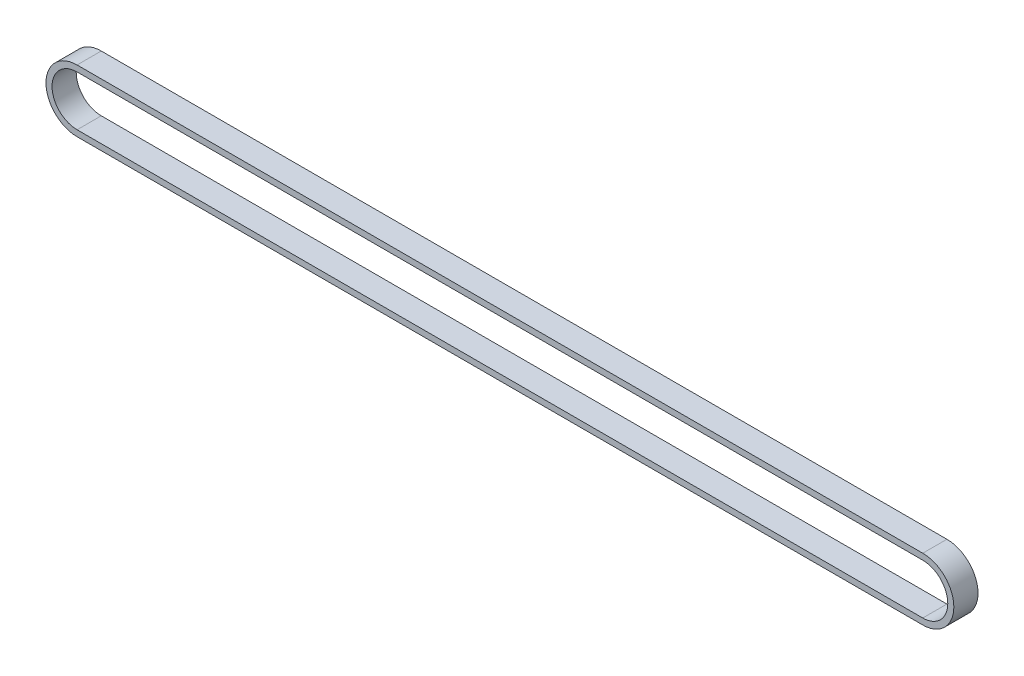
ISO-10303-21;
HEADER;
FILE_DESCRIPTION(('STEP AP214'),'2;1');
FILE_NAME('part.step','',(''),(''),'','','');
FILE_SCHEMA(('AUTOMOTIVE_DESIGN { 1 0 10303 214 1 1 1 1 }'));
ENDSEC;
DATA;
#1=APPLICATION_CONTEXT('core data for automotive mechanical design processes');
#2=APPLICATION_PROTOCOL_DEFINITION('international standard','automotive_design',2000,#1);
#3=PRODUCT_CONTEXT('',#1,'mechanical');
#4=PRODUCT('Part','Part','',(#3));
#5=PRODUCT_RELATED_PRODUCT_CATEGORY('part','',(#4));
#6=PRODUCT_DEFINITION_FORMATION('','',#4);
#7=PRODUCT_DEFINITION_CONTEXT('part definition',#1,'design');
#8=PRODUCT_DEFINITION('design','',#6,#7);
#9=PRODUCT_DEFINITION_SHAPE('','',#8);
#10=(LENGTH_UNIT() NAMED_UNIT(*) SI_UNIT(.MILLI.,.METRE.));
#11=(NAMED_UNIT(*) PLANE_ANGLE_UNIT() SI_UNIT($,.RADIAN.));
#12=(NAMED_UNIT(*) SI_UNIT($,.STERADIAN.) SOLID_ANGLE_UNIT());
#13=UNCERTAINTY_MEASURE_WITH_UNIT(LENGTH_MEASURE(1.E-05),#10,'distance_accuracy_value','');
#14=(GEOMETRIC_REPRESENTATION_CONTEXT(3) GLOBAL_UNCERTAINTY_ASSIGNED_CONTEXT((#13)) GLOBAL_UNIT_ASSIGNED_CONTEXT((#10,
#11,#12)) REPRESENTATION_CONTEXT('',''));
#15=CARTESIAN_POINT('',(0.,0.,0.));
#16=DIRECTION('',(0.,0.,1.));
#17=DIRECTION('',(1.,0.,0.));
#18=AXIS2_PLACEMENT_3D('',#15,#16,#17);
#19=CARTESIAN_POINT('',(0.,0.,6.));
#20=DIRECTION('',(0.,0.,1.));
#21=DIRECTION('',(1.,0.,0.));
#22=AXIS2_PLACEMENT_3D('',#19,#20,#21);
#23=PLANE('',#22);
#24=CARTESIAN_POINT('',(0.,0.,6.));
#25=DIRECTION('',(0.,0.,1.));
#26=DIRECTION('',(1.,0.,0.));
#27=AXIS2_PLACEMENT_3D('',#24,#25,#26);
#28=CIRCLE('',#27,7.72);
#29=CARTESIAN_POINT('',(0.,7.72,6.));
#30=VERTEX_POINT('',#29);
#31=CARTESIAN_POINT('',(0.,-7.72,6.));
#32=VERTEX_POINT('',#31);
#33=EDGE_CURVE('E135',#30,#32,#28,.T.);
#34=ORIENTED_EDGE('',*,*,#33,.T.);
#35=DIRECTION('',(1.,0.,0.));
#36=VECTOR('',#35,1.);
#37=CARTESIAN_POINT('',(0.,-7.72,6.));
#38=LINE('',#37,#36);
#39=CARTESIAN_POINT('',(210.,-7.72,6.));
#40=VERTEX_POINT('',#39);
#41=EDGE_CURVE('E138',#32,#40,#38,.T.);
#42=ORIENTED_EDGE('',*,*,#41,.T.);
#43=CARTESIAN_POINT('',(210.,0.,6.));
#44=DIRECTION('',(0.,0.,1.));
#45=DIRECTION('',(1.,0.,0.));
#46=AXIS2_PLACEMENT_3D('',#43,#44,#45);
#47=CIRCLE('',#46,7.72);
#48=CARTESIAN_POINT('',(210.,7.72,6.));
#49=VERTEX_POINT('',#48);
#50=EDGE_CURVE('E141',#40,#49,#47,.T.);
#51=ORIENTED_EDGE('',*,*,#50,.T.);
#52=DIRECTION('',(-1.,0.,0.));
#53=VECTOR('',#52,1.);
#54=CARTESIAN_POINT('',(0.,7.72,6.));
#55=LINE('',#54,#53);
#56=EDGE_CURVE('E143',#49,#30,#55,.T.);
#57=ORIENTED_EDGE('',*,*,#56,.T.);
#58=EDGE_LOOP('',(#34,#42,#51,#57));
#59=FACE_BOUND('',#58,.T.);
#60=DIRECTION('',(1.,0.,0.));
#61=VECTOR('',#60,1.);
#62=CARTESIAN_POINT('',(0.,-6.215,6.));
#63=LINE('',#62,#61);
#64=CARTESIAN_POINT('',(0.,-6.215,6.));
#65=VERTEX_POINT('',#64);
#66=CARTESIAN_POINT('',(210.,-6.215,6.));
#67=VERTEX_POINT('',#66);
#68=EDGE_CURVE('E107',#65,#67,#63,.T.);
#69=ORIENTED_EDGE('',*,*,#68,.F.);
#70=CARTESIAN_POINT('',(0.,0.,6.));
#71=DIRECTION('',(0.,0.,1.));
#72=DIRECTION('',(1.,0.,0.));
#73=AXIS2_PLACEMENT_3D('',#70,#71,#72);
#74=CIRCLE('',#73,6.215);
#75=CARTESIAN_POINT('',(0.,6.215,6.));
#76=VERTEX_POINT('',#75);
#77=EDGE_CURVE('E99',#76,#65,#74,.T.);
#78=ORIENTED_EDGE('',*,*,#77,.F.);
#79=DIRECTION('',(-1.,0.,0.));
#80=VECTOR('',#79,1.);
#81=CARTESIAN_POINT('',(0.,6.215,6.));
#82=LINE('',#81,#80);
#83=CARTESIAN_POINT('',(210.,6.215,6.));
#84=VERTEX_POINT('',#83);
#85=EDGE_CURVE('E121',#84,#76,#82,.T.);
#86=ORIENTED_EDGE('',*,*,#85,.F.);
#87=CARTESIAN_POINT('',(210.,0.,6.));
#88=DIRECTION('',(0.,0.,1.));
#89=DIRECTION('',(1.,0.,0.));
#90=AXIS2_PLACEMENT_3D('',#87,#88,#89);
#91=CIRCLE('',#90,6.215);
#92=EDGE_CURVE('E119',#67,#84,#91,.T.);
#93=ORIENTED_EDGE('',*,*,#92,.F.);
#94=EDGE_LOOP('',(#69,#78,#86,#93));
#95=FACE_BOUND('',#94,.T.);
#96=ADVANCED_FACE('F34',(#59,#95),#23,.T.);
#97=CARTESIAN_POINT('',(0.,0.,0.));
#98=DIRECTION('',(0.,0.,1.));
#99=DIRECTION('',(1.,0.,0.));
#100=AXIS2_PLACEMENT_3D('',#97,#98,#99);
#101=PLANE('',#100);
#102=CARTESIAN_POINT('',(0.,0.,0.));
#103=DIRECTION('',(0.,0.,1.));
#104=DIRECTION('',(1.,0.,0.));
#105=AXIS2_PLACEMENT_3D('',#102,#103,#104);
#106=CIRCLE('',#105,7.72);
#107=CARTESIAN_POINT('',(0.,7.72,0.));
#108=VERTEX_POINT('',#107);
#109=CARTESIAN_POINT('',(0.,-7.72,0.));
#110=VERTEX_POINT('',#109);
#111=EDGE_CURVE('E115',#108,#110,#106,.T.);
#112=ORIENTED_EDGE('',*,*,#111,.F.);
#113=DIRECTION('',(-1.,0.,0.));
#114=VECTOR('',#113,1.);
#115=CARTESIAN_POINT('',(0.,7.72,0.));
#116=LINE('',#115,#114);
#117=CARTESIAN_POINT('',(210.,7.72,0.));
#118=VERTEX_POINT('',#117);
#119=EDGE_CURVE('E139',#118,#108,#116,.T.);
#120=ORIENTED_EDGE('',*,*,#119,.F.);
#121=CARTESIAN_POINT('',(210.,0.,0.));
#122=DIRECTION('',(0.,0.,1.));
#123=DIRECTION('',(1.,0.,0.));
#124=AXIS2_PLACEMENT_3D('',#121,#122,#123);
#125=CIRCLE('',#124,7.72);
#126=CARTESIAN_POINT('',(210.,-7.72,0.));
#127=VERTEX_POINT('',#126);
#128=EDGE_CURVE('E150',#127,#118,#125,.T.);
#129=ORIENTED_EDGE('',*,*,#128,.F.);
#130=DIRECTION('',(1.,0.,0.));
#131=VECTOR('',#130,1.);
#132=CARTESIAN_POINT('',(0.,-7.72,0.));
#133=LINE('',#132,#131);
#134=EDGE_CURVE('E148',#110,#127,#133,.T.);
#135=ORIENTED_EDGE('',*,*,#134,.F.);
#136=EDGE_LOOP('',(#112,#120,#129,#135));
#137=FACE_BOUND('',#136,.T.);
#138=CARTESIAN_POINT('',(0.,0.,0.));
#139=DIRECTION('',(0.,0.,1.));
#140=DIRECTION('',(1.,0.,0.));
#141=AXIS2_PLACEMENT_3D('',#138,#139,#140);
#142=CIRCLE('',#141,6.215);
#143=CARTESIAN_POINT('',(0.,6.215,0.));
#144=VERTEX_POINT('',#143);
#145=CARTESIAN_POINT('',(0.,-6.215,0.));
#146=VERTEX_POINT('',#145);
#147=EDGE_CURVE('E57',#144,#146,#142,.T.);
#148=ORIENTED_EDGE('',*,*,#147,.T.);
#149=DIRECTION('',(1.,0.,0.));
#150=VECTOR('',#149,1.);
#151=CARTESIAN_POINT('',(0.,-6.215,0.));
#152=LINE('',#151,#150);
#153=CARTESIAN_POINT('',(210.,-6.215,0.));
#154=VERTEX_POINT('',#153);
#155=EDGE_CURVE('E114',#146,#154,#152,.T.);
#156=ORIENTED_EDGE('',*,*,#155,.T.);
#157=CARTESIAN_POINT('',(210.,0.,0.));
#158=DIRECTION('',(0.,0.,1.));
#159=DIRECTION('',(1.,0.,0.));
#160=AXIS2_PLACEMENT_3D('',#157,#158,#159);
#161=CIRCLE('',#160,6.215);
#162=CARTESIAN_POINT('',(210.,6.215,0.));
#163=VERTEX_POINT('',#162);
#164=EDGE_CURVE('E127',#154,#163,#161,.T.);
#165=ORIENTED_EDGE('',*,*,#164,.T.);
#166=DIRECTION('',(-1.,0.,0.));
#167=VECTOR('',#166,1.);
#168=CARTESIAN_POINT('',(0.,6.215,0.));
#169=LINE('',#168,#167);
#170=EDGE_CURVE('E108',#163,#144,#169,.T.);
#171=ORIENTED_EDGE('',*,*,#170,.T.);
#172=EDGE_LOOP('',(#148,#156,#165,#171));
#173=FACE_BOUND('',#172,.T.);
#174=ADVANCED_FACE('F168',(#137,#173),#101,.F.);
#175=CARTESIAN_POINT('',(0.,0.,6.));
#176=DIRECTION('',(0.,0.,-1.));
#177=DIRECTION('',(-1.,0.,0.));
#178=AXIS2_PLACEMENT_3D('',#175,#176,#177);
#179=CYLINDRICAL_SURFACE('',#178,7.72);
#180=ORIENTED_EDGE('',*,*,#111,.T.);
#181=DIRECTION('',(0.,0.,-1.));
#182=VECTOR('',#181,1.);
#183=CARTESIAN_POINT('',(0.,-7.72,6.));
#184=LINE('',#183,#182);
#185=EDGE_CURVE('E11',#32,#110,#184,.T.);
#186=ORIENTED_EDGE('',*,*,#185,.F.);
#187=ORIENTED_EDGE('',*,*,#33,.F.);
#188=DIRECTION('',(0.,0.,-1.));
#189=VECTOR('',#188,1.);
#190=CARTESIAN_POINT('',(0.,7.72,6.));
#191=LINE('',#190,#189);
#192=EDGE_CURVE('E145',#30,#108,#191,.T.);
#193=ORIENTED_EDGE('',*,*,#192,.T.);
#194=EDGE_LOOP('',(#180,#186,#187,#193));
#195=FACE_BOUND('',#194,.T.);
#196=ADVANCED_FACE('F36',(#195),#179,.T.);
#197=CARTESIAN_POINT('',(0.,-7.72,6.));
#198=DIRECTION('',(0.,1.,0.));
#199=DIRECTION('',(0.,0.,1.));
#200=AXIS2_PLACEMENT_3D('',#197,#198,#199);
#201=PLANE('',#200);
#202=ORIENTED_EDGE('',*,*,#134,.T.);
#203=DIRECTION('',(0.,0.,-1.));
#204=VECTOR('',#203,1.);
#205=CARTESIAN_POINT('',(210.,-7.72,6.));
#206=LINE('',#205,#204);
#207=EDGE_CURVE('E42',#40,#127,#206,.T.);
#208=ORIENTED_EDGE('',*,*,#207,.F.);
#209=ORIENTED_EDGE('',*,*,#41,.F.);
#210=ORIENTED_EDGE('',*,*,#185,.T.);
#211=EDGE_LOOP('',(#202,#208,#209,#210));
#212=FACE_BOUND('',#211,.T.);
#213=ADVANCED_FACE('F178',(#212),#201,.F.);
#214=CARTESIAN_POINT('',(210.,0.,6.));
#215=DIRECTION('',(0.,0.,-1.));
#216=DIRECTION('',(-1.,0.,0.));
#217=AXIS2_PLACEMENT_3D('',#214,#215,#216);
#218=CYLINDRICAL_SURFACE('',#217,7.72);
#219=ORIENTED_EDGE('',*,*,#128,.T.);
#220=DIRECTION('',(0.,0.,-1.));
#221=VECTOR('',#220,1.);
#222=CARTESIAN_POINT('',(210.,7.72,6.));
#223=LINE('',#222,#221);
#224=EDGE_CURVE('E155',#49,#118,#223,.T.);
#225=ORIENTED_EDGE('',*,*,#224,.F.);
#226=ORIENTED_EDGE('',*,*,#50,.F.);
#227=ORIENTED_EDGE('',*,*,#207,.T.);
#228=EDGE_LOOP('',(#219,#225,#226,#227));
#229=FACE_BOUND('',#228,.T.);
#230=ADVANCED_FACE('F162',(#229),#218,.T.);
#231=CARTESIAN_POINT('',(0.,7.72,6.));
#232=DIRECTION('',(0.,-1.,0.));
#233=DIRECTION('',(0.,0.,-1.));
#234=AXIS2_PLACEMENT_3D('',#231,#232,#233);
#235=PLANE('',#234);
#236=ORIENTED_EDGE('',*,*,#119,.T.);
#237=ORIENTED_EDGE('',*,*,#192,.F.);
#238=ORIENTED_EDGE('',*,*,#56,.F.);
#239=ORIENTED_EDGE('',*,*,#224,.T.);
#240=EDGE_LOOP('',(#236,#237,#238,#239));
#241=FACE_BOUND('',#240,.T.);
#242=ADVANCED_FACE('F172',(#241),#235,.F.);
#243=CARTESIAN_POINT('',(0.,0.,6.));
#244=DIRECTION('',(0.,0.,-1.));
#245=DIRECTION('',(-1.,0.,0.));
#246=AXIS2_PLACEMENT_3D('',#243,#244,#245);
#247=CYLINDRICAL_SURFACE('',#246,6.215);
#248=ORIENTED_EDGE('',*,*,#147,.F.);
#249=DIRECTION('',(0.,0.,-1.));
#250=VECTOR('',#249,1.);
#251=CARTESIAN_POINT('',(0.,6.215,6.));
#252=LINE('',#251,#250);
#253=EDGE_CURVE('E103',#76,#144,#252,.T.);
#254=ORIENTED_EDGE('',*,*,#253,.F.);
#255=ORIENTED_EDGE('',*,*,#77,.T.);
#256=DIRECTION('',(0.,0.,-1.));
#257=VECTOR('',#256,1.);
#258=CARTESIAN_POINT('',(0.,-6.215,6.));
#259=LINE('',#258,#257);
#260=EDGE_CURVE('E102',#65,#146,#259,.T.);
#261=ORIENTED_EDGE('',*,*,#260,.T.);
#262=EDGE_LOOP('',(#248,#254,#255,#261));
#263=FACE_BOUND('',#262,.T.);
#264=ADVANCED_FACE('F101',(#263),#247,.F.);
#265=CARTESIAN_POINT('',(0.,-6.215,6.));
#266=DIRECTION('',(0.,1.,0.));
#267=DIRECTION('',(0.,0.,1.));
#268=AXIS2_PLACEMENT_3D('',#265,#266,#267);
#269=PLANE('',#268);
#270=ORIENTED_EDGE('',*,*,#155,.F.);
#271=ORIENTED_EDGE('',*,*,#260,.F.);
#272=ORIENTED_EDGE('',*,*,#68,.T.);
#273=DIRECTION('',(0.,0.,-1.));
#274=VECTOR('',#273,1.);
#275=CARTESIAN_POINT('',(210.,-6.215,6.));
#276=LINE('',#275,#274);
#277=EDGE_CURVE('E116',#67,#154,#276,.T.);
#278=ORIENTED_EDGE('',*,*,#277,.T.);
#279=EDGE_LOOP('',(#270,#271,#272,#278));
#280=FACE_BOUND('',#279,.T.);
#281=ADVANCED_FACE('F111',(#280),#269,.T.);
#282=CARTESIAN_POINT('',(210.,0.,6.));
#283=DIRECTION('',(0.,0.,-1.));
#284=DIRECTION('',(-1.,0.,0.));
#285=AXIS2_PLACEMENT_3D('',#282,#283,#284);
#286=CYLINDRICAL_SURFACE('',#285,6.215);
#287=ORIENTED_EDGE('',*,*,#164,.F.);
#288=ORIENTED_EDGE('',*,*,#277,.F.);
#289=ORIENTED_EDGE('',*,*,#92,.T.);
#290=DIRECTION('',(0.,0.,-1.));
#291=VECTOR('',#290,1.);
#292=CARTESIAN_POINT('',(210.,6.215,6.));
#293=LINE('',#292,#291);
#294=EDGE_CURVE('E49',#84,#163,#293,.T.);
#295=ORIENTED_EDGE('',*,*,#294,.T.);
#296=EDGE_LOOP('',(#287,#288,#289,#295));
#297=FACE_BOUND('',#296,.T.);
#298=ADVANCED_FACE('F201',(#297),#286,.F.);
#299=CARTESIAN_POINT('',(0.,6.215,6.));
#300=DIRECTION('',(0.,-1.,0.));
#301=DIRECTION('',(0.,0.,-1.));
#302=AXIS2_PLACEMENT_3D('',#299,#300,#301);
#303=PLANE('',#302);
#304=ORIENTED_EDGE('',*,*,#170,.F.);
#305=ORIENTED_EDGE('',*,*,#294,.F.);
#306=ORIENTED_EDGE('',*,*,#85,.T.);
#307=ORIENTED_EDGE('',*,*,#253,.T.);
#308=EDGE_LOOP('',(#304,#305,#306,#307));
#309=FACE_BOUND('',#308,.T.);
#310=ADVANCED_FACE('F205',(#309),#303,.T.);
#311=CLOSED_SHELL('',(#96,#174,#196,#213,#230,#242,#264,#281,#298,#310));
#312=MANIFOLD_SOLID_BREP('B2',#311);
#313=ADVANCED_BREP_SHAPE_REPRESENTATION('',(#18,#312),#14);
#314=SHAPE_DEFINITION_REPRESENTATION(#9,#313);
ENDSEC;
END-ISO-10303-21;
